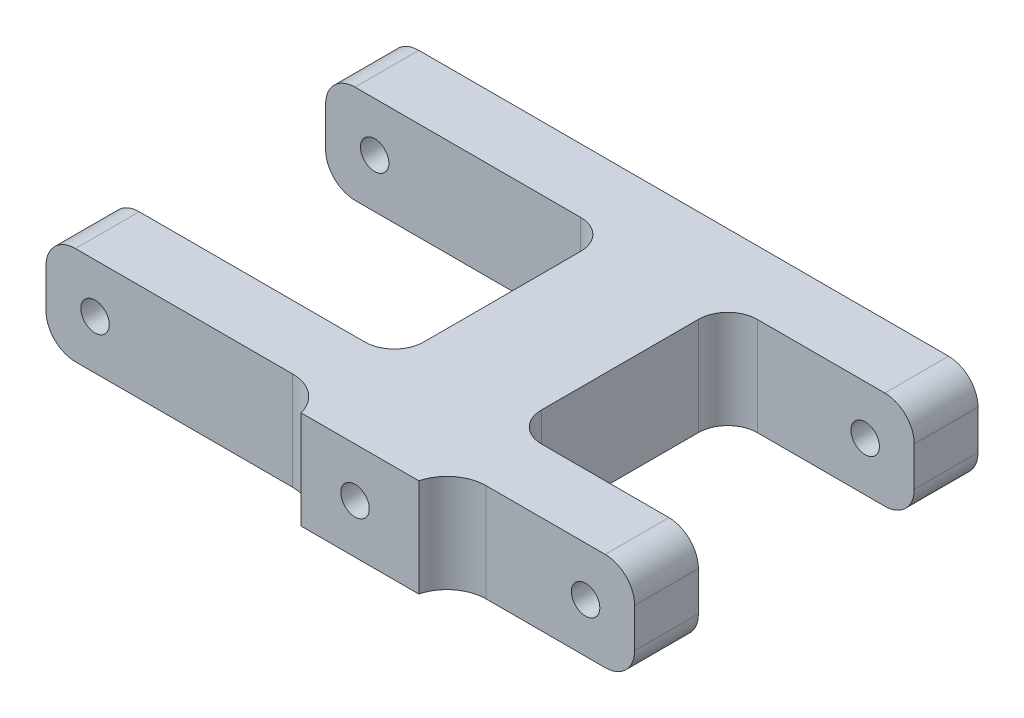
ISO-10303-21;
HEADER;
FILE_DESCRIPTION(('STEP AP214'),'2;1');
FILE_NAME('part.step','',(''),(''),'','','');
FILE_SCHEMA(('AUTOMOTIVE_DESIGN { 1 0 10303 214 1 1 1 1 }'));
ENDSEC;
DATA;
#1=APPLICATION_CONTEXT('core data for automotive mechanical design processes');
#2=APPLICATION_PROTOCOL_DEFINITION('international standard','automotive_design',2000,#1);
#3=PRODUCT_CONTEXT('',#1,'mechanical');
#4=PRODUCT('Part','Part','',(#3));
#5=PRODUCT_RELATED_PRODUCT_CATEGORY('part','',(#4));
#6=PRODUCT_DEFINITION_FORMATION('','',#4);
#7=PRODUCT_DEFINITION_CONTEXT('part definition',#1,'design');
#8=PRODUCT_DEFINITION('design','',#6,#7);
#9=PRODUCT_DEFINITION_SHAPE('','',#8);
#10=(LENGTH_UNIT() NAMED_UNIT(*) SI_UNIT(.MILLI.,.METRE.));
#11=(NAMED_UNIT(*) PLANE_ANGLE_UNIT() SI_UNIT($,.RADIAN.));
#12=(NAMED_UNIT(*) SI_UNIT($,.STERADIAN.) SOLID_ANGLE_UNIT());
#13=UNCERTAINTY_MEASURE_WITH_UNIT(LENGTH_MEASURE(1.E-05),#10,'distance_accuracy_value','');
#14=(GEOMETRIC_REPRESENTATION_CONTEXT(3) GLOBAL_UNCERTAINTY_ASSIGNED_CONTEXT((#13)) GLOBAL_UNIT_ASSIGNED_CONTEXT((#10,
#11,#12)) REPRESENTATION_CONTEXT('',''));
#15=CARTESIAN_POINT('',(0.,0.,0.));
#16=DIRECTION('',(0.,0.,1.));
#17=DIRECTION('',(1.,0.,0.));
#18=AXIS2_PLACEMENT_3D('',#15,#16,#17);
#19=CARTESIAN_POINT('',(0.,10.,35.));
#20=DIRECTION('',(0.,0.,-1.));
#21=DIRECTION('',(-1.,0.,0.));
#22=AXIS2_PLACEMENT_3D('',#19,#20,#21);
#23=PLANE('',#22);
#24=CARTESIAN_POINT('',(5.,5.,35.));
#25=DIRECTION('',(0.,0.,1.));
#26=DIRECTION('',(1.,0.,0.));
#27=AXIS2_PLACEMENT_3D('',#24,#25,#26);
#28=CIRCLE('',#27,1.45);
#29=CARTESIAN_POINT('',(6.45,5.,35.));
#30=VERTEX_POINT('',#29);
#31=EDGE_CURVE('E254',#30,#30,#28,.T.);
#32=ORIENTED_EDGE('',*,*,#31,.F.);
#33=EDGE_LOOP('',(#32));
#34=FACE_BOUND('',#33,.T.);
#35=DIRECTION('',(1.,0.,0.));
#36=VECTOR('',#35,1.);
#37=CARTESIAN_POINT('',(0.,0.,35.));
#38=LINE('',#37,#36);
#39=CARTESIAN_POINT('',(3.,0.,35.));
#40=VERTEX_POINT('',#39);
#41=CARTESIAN_POINT('',(25.1270166537926,0.,35.));
#42=VERTEX_POINT('',#41);
#43=EDGE_CURVE('E312',#40,#42,#38,.T.);
#44=ORIENTED_EDGE('',*,*,#43,.T.);
#45=DIRECTION('',(0.,-1.,0.));
#46=VECTOR('',#45,1.);
#47=CARTESIAN_POINT('',(25.1270166537926,10.,35.));
#48=LINE('',#47,#46);
#49=CARTESIAN_POINT('',(25.1270166537926,10.,35.));
#50=VERTEX_POINT('',#49);
#51=EDGE_CURVE('E54',#42,#50,#48,.F.);
#52=ORIENTED_EDGE('',*,*,#51,.T.);
#53=DIRECTION('',(1.,0.,0.));
#54=VECTOR('',#53,1.);
#55=CARTESIAN_POINT('',(0.,10.,35.));
#56=LINE('',#55,#54);
#57=CARTESIAN_POINT('',(3.,10.,35.));
#58=VERTEX_POINT('',#57);
#59=EDGE_CURVE('E305',#58,#50,#56,.T.);
#60=ORIENTED_EDGE('',*,*,#59,.F.);
#61=CARTESIAN_POINT('',(3.,7.,35.));
#62=DIRECTION('',(0.,0.,-1.));
#63=DIRECTION('',(-1.,0.,0.));
#64=AXIS2_PLACEMENT_3D('',#61,#62,#63);
#65=CIRCLE('',#64,3.);
#66=CARTESIAN_POINT('',(0.,7.,35.));
#67=VERTEX_POINT('',#66);
#68=EDGE_CURVE('E342',#58,#67,#65,.F.);
#69=ORIENTED_EDGE('',*,*,#68,.T.);
#70=DIRECTION('',(0.,-1.,0.));
#71=VECTOR('',#70,1.);
#72=CARTESIAN_POINT('',(0.,10.,35.));
#73=LINE('',#72,#71);
#74=CARTESIAN_POINT('',(0.,3.,35.));
#75=VERTEX_POINT('',#74);
#76=EDGE_CURVE('E325',#67,#75,#73,.T.);
#77=ORIENTED_EDGE('',*,*,#76,.T.);
#78=CARTESIAN_POINT('',(3.,3.,35.));
#79=DIRECTION('',(0.,0.,-1.));
#80=DIRECTION('',(-1.,0.,0.));
#81=AXIS2_PLACEMENT_3D('',#78,#79,#80);
#82=CIRCLE('',#81,3.);
#83=EDGE_CURVE('E344',#75,#40,#82,.F.);
#84=ORIENTED_EDGE('',*,*,#83,.T.);
#85=EDGE_LOOP('',(#44,#52,#60,#69,#77,#84));
#86=FACE_BOUND('',#85,.T.);
#87=ADVANCED_FACE('F33',(#34,#86),#23,.F.);
#88=CARTESIAN_POINT('',(55.,5.,35.));
#89=DIRECTION('',(0.,0.,1.));
#90=DIRECTION('',(1.,0.,0.));
#91=AXIS2_PLACEMENT_3D('',#88,#89,#90);
#92=CIRCLE('',#91,1.45);
#93=CARTESIAN_POINT('',(56.45,5.,35.));
#94=VERTEX_POINT('',#93);
#95=EDGE_CURVE('E244',#94,#94,#92,.T.);
#96=ORIENTED_EDGE('',*,*,#95,.F.);
#97=EDGE_LOOP('',(#96));
#98=FACE_BOUND('',#97,.T.);
#99=CARTESIAN_POINT('',(44.8729833462074,10.,35.));
#100=VERTEX_POINT('',#99);
#101=CARTESIAN_POINT('',(57.,10.,35.));
#102=VERTEX_POINT('',#101);
#103=EDGE_CURVE('E308',#100,#102,#56,.T.);
#104=ORIENTED_EDGE('',*,*,#103,.F.);
#105=DIRECTION('',(0.,1.,0.));
#106=VECTOR('',#105,1.);
#107=CARTESIAN_POINT('',(44.8729833462074,10.,35.));
#108=LINE('',#107,#106);
#109=CARTESIAN_POINT('',(44.8729833462074,0.,35.));
#110=VERTEX_POINT('',#109);
#111=EDGE_CURVE('E448',#100,#110,#108,.F.);
#112=ORIENTED_EDGE('',*,*,#111,.T.);
#113=CARTESIAN_POINT('',(57.,0.,35.));
#114=VERTEX_POINT('',#113);
#115=EDGE_CURVE('E299',#110,#114,#38,.T.);
#116=ORIENTED_EDGE('',*,*,#115,.T.);
#117=CARTESIAN_POINT('',(57.,3.,35.));
#118=DIRECTION('',(0.,0.,-1.));
#119=DIRECTION('',(-1.,0.,0.));
#120=AXIS2_PLACEMENT_3D('',#117,#118,#119);
#121=CIRCLE('',#120,3.);
#122=CARTESIAN_POINT('',(60.,3.,35.));
#123=VERTEX_POINT('',#122);
#124=EDGE_CURVE('E340',#114,#123,#121,.F.);
#125=ORIENTED_EDGE('',*,*,#124,.T.);
#126=DIRECTION('',(0.,-1.,0.));
#127=VECTOR('',#126,1.);
#128=CARTESIAN_POINT('',(60.,10.,35.));
#129=LINE('',#128,#127);
#130=CARTESIAN_POINT('',(60.,7.,35.));
#131=VERTEX_POINT('',#130);
#132=EDGE_CURVE('E322',#131,#123,#129,.T.);
#133=ORIENTED_EDGE('',*,*,#132,.F.);
#134=CARTESIAN_POINT('',(57.,7.,35.));
#135=DIRECTION('',(0.,0.,-1.));
#136=DIRECTION('',(-1.,0.,0.));
#137=AXIS2_PLACEMENT_3D('',#134,#135,#136);
#138=CIRCLE('',#137,3.);
#139=EDGE_CURVE('E337',#131,#102,#138,.F.);
#140=ORIENTED_EDGE('',*,*,#139,.T.);
#141=EDGE_LOOP('',(#104,#112,#116,#125,#133,#140));
#142=FACE_BOUND('',#141,.T.);
#143=ADVANCED_FACE('F460',(#98,#142),#23,.F.);
#144=CARTESIAN_POINT('',(0.,10.,0.));
#145=DIRECTION('',(1.,0.,0.));
#146=DIRECTION('',(0.,0.,-1.));
#147=AXIS2_PLACEMENT_3D('',#144,#145,#146);
#148=PLANE('',#147);
#149=DIRECTION('',(0.,-1.,0.));
#150=VECTOR('',#149,1.);
#151=CARTESIAN_POINT('',(0.,10.,0.));
#152=LINE('',#151,#150);
#153=CARTESIAN_POINT('',(0.,7.,0.));
#154=VERTEX_POINT('',#153);
#155=CARTESIAN_POINT('',(0.,3.,0.));
#156=VERTEX_POINT('',#155);
#157=EDGE_CURVE('E311',#154,#156,#152,.T.);
#158=ORIENTED_EDGE('',*,*,#157,.T.);
#159=DIRECTION('',(0.,0.,1.));
#160=VECTOR('',#159,1.);
#161=CARTESIAN_POINT('',(0.,3.,0.));
#162=LINE('',#161,#160);
#163=CARTESIAN_POINT('',(0.,3.,6.5));
#164=VERTEX_POINT('',#163);
#165=EDGE_CURVE('E376',#156,#164,#162,.T.);
#166=ORIENTED_EDGE('',*,*,#165,.T.);
#167=DIRECTION('',(0.,-1.,0.));
#168=VECTOR('',#167,1.);
#169=CARTESIAN_POINT('',(0.,10.,6.5));
#170=LINE('',#169,#168);
#171=CARTESIAN_POINT('',(0.,7.,6.5));
#172=VERTEX_POINT('',#171);
#173=EDGE_CURVE('E264',#172,#164,#170,.T.);
#174=ORIENTED_EDGE('',*,*,#173,.F.);
#175=DIRECTION('',(0.,0.,1.));
#176=VECTOR('',#175,1.);
#177=CARTESIAN_POINT('',(0.,7.,0.));
#178=LINE('',#177,#176);
#179=EDGE_CURVE('E374',#172,#154,#178,.F.);
#180=ORIENTED_EDGE('',*,*,#179,.T.);
#181=EDGE_LOOP('',(#158,#166,#174,#180));
#182=FACE_BOUND('',#181,.T.);
#183=ADVANCED_FACE('F481',(#182),#148,.F.);
#184=CARTESIAN_POINT('',(60.,10.,0.));
#185=DIRECTION('',(-1.,0.,0.));
#186=DIRECTION('',(0.,0.,1.));
#187=AXIS2_PLACEMENT_3D('',#184,#185,#186);
#188=PLANE('',#187);
#189=ORIENTED_EDGE('',*,*,#132,.T.);
#190=DIRECTION('',(0.,0.,-1.));
#191=VECTOR('',#190,1.);
#192=CARTESIAN_POINT('',(60.,3.,0.));
#193=LINE('',#192,#191);
#194=CARTESIAN_POINT('',(60.,3.,28.5));
#195=VERTEX_POINT('',#194);
#196=EDGE_CURVE('E404',#123,#195,#193,.T.);
#197=ORIENTED_EDGE('',*,*,#196,.T.);
#198=DIRECTION('',(0.,-1.,0.));
#199=VECTOR('',#198,1.);
#200=CARTESIAN_POINT('',(60.,10.,28.5));
#201=LINE('',#200,#199);
#202=CARTESIAN_POINT('',(60.,7.,28.5));
#203=VERTEX_POINT('',#202);
#204=EDGE_CURVE('E279',#203,#195,#201,.T.);
#205=ORIENTED_EDGE('',*,*,#204,.F.);
#206=DIRECTION('',(0.,0.,-1.));
#207=VECTOR('',#206,1.);
#208=CARTESIAN_POINT('',(60.,7.,35.));
#209=LINE('',#208,#207);
#210=EDGE_CURVE('E402',#203,#131,#209,.F.);
#211=ORIENTED_EDGE('',*,*,#210,.T.);
#212=EDGE_LOOP('',(#189,#197,#205,#211));
#213=FACE_BOUND('',#212,.T.);
#214=ADVANCED_FACE('F491',(#213),#188,.F.);
#215=DIRECTION('',(0.,1.,0.));
#216=VECTOR('',#215,1.);
#217=CARTESIAN_POINT('',(0.,10.,28.5));
#218=LINE('',#217,#216);
#219=CARTESIAN_POINT('',(0.,3.,28.5));
#220=VERTEX_POINT('',#219);
#221=CARTESIAN_POINT('',(0.,7.,28.5));
#222=VERTEX_POINT('',#221);
#223=EDGE_CURVE('E269',#220,#222,#218,.T.);
#224=ORIENTED_EDGE('',*,*,#223,.F.);
#225=DIRECTION('',(0.,0.,1.));
#226=VECTOR('',#225,1.);
#227=CARTESIAN_POINT('',(0.,3.,0.));
#228=LINE('',#227,#226);
#229=EDGE_CURVE('E334',#220,#75,#228,.T.);
#230=ORIENTED_EDGE('',*,*,#229,.T.);
#231=ORIENTED_EDGE('',*,*,#76,.F.);
#232=DIRECTION('',(0.,0.,1.));
#233=VECTOR('',#232,1.);
#234=CARTESIAN_POINT('',(0.,7.,28.5));
#235=LINE('',#234,#233);
#236=EDGE_CURVE('E328',#67,#222,#235,.F.);
#237=ORIENTED_EDGE('',*,*,#236,.T.);
#238=EDGE_LOOP('',(#224,#230,#231,#237));
#239=FACE_BOUND('',#238,.T.);
#240=ADVANCED_FACE('F488',(#239),#148,.F.);
#241=DIRECTION('',(0.,-1.,0.));
#242=VECTOR('',#241,1.);
#243=CARTESIAN_POINT('',(60.,10.,0.));
#244=LINE('',#243,#242);
#245=CARTESIAN_POINT('',(60.,7.,0.));
#246=VERTEX_POINT('',#245);
#247=CARTESIAN_POINT('',(60.,3.,0.));
#248=VERTEX_POINT('',#247);
#249=EDGE_CURVE('E319',#246,#248,#244,.T.);
#250=ORIENTED_EDGE('',*,*,#249,.F.);
#251=DIRECTION('',(0.,0.,-1.));
#252=VECTOR('',#251,1.);
#253=CARTESIAN_POINT('',(60.,7.,6.5));
#254=LINE('',#253,#252);
#255=CARTESIAN_POINT('',(60.,7.,6.5));
#256=VERTEX_POINT('',#255);
#257=EDGE_CURVE('E395',#246,#256,#254,.F.);
#258=ORIENTED_EDGE('',*,*,#257,.T.);
#259=DIRECTION('',(0.,1.,0.));
#260=VECTOR('',#259,1.);
#261=CARTESIAN_POINT('',(60.,10.,6.5));
#262=LINE('',#261,#260);
#263=CARTESIAN_POINT('',(60.,3.,6.5));
#264=VERTEX_POINT('',#263);
#265=EDGE_CURVE('E289',#264,#256,#262,.T.);
#266=ORIENTED_EDGE('',*,*,#265,.F.);
#267=DIRECTION('',(0.,0.,-1.));
#268=VECTOR('',#267,1.);
#269=CARTESIAN_POINT('',(60.,3.,0.));
#270=LINE('',#269,#268);
#271=EDGE_CURVE('E392',#264,#248,#270,.T.);
#272=ORIENTED_EDGE('',*,*,#271,.T.);
#273=EDGE_LOOP('',(#250,#258,#266,#272));
#274=FACE_BOUND('',#273,.T.);
#275=ADVANCED_FACE('F486',(#274),#188,.F.);
#276=CARTESIAN_POINT('',(0.,10.,0.));
#277=DIRECTION('',(0.,0.,1.));
#278=DIRECTION('',(1.,0.,0.));
#279=AXIS2_PLACEMENT_3D('',#276,#277,#278);
#280=PLANE('',#279);
#281=CARTESIAN_POINT('',(55.,5.,0.));
#282=DIRECTION('',(0.,0.,1.));
#283=DIRECTION('',(1.,0.,0.));
#284=AXIS2_PLACEMENT_3D('',#281,#282,#283);
#285=CIRCLE('',#284,1.45);
#286=CARTESIAN_POINT('',(56.45,5.,0.));
#287=VERTEX_POINT('',#286);
#288=EDGE_CURVE('E245',#287,#287,#285,.T.);
#289=ORIENTED_EDGE('',*,*,#288,.T.);
#290=EDGE_LOOP('',(#289));
#291=FACE_BOUND('',#290,.T.);
#292=CARTESIAN_POINT('',(5.,5.,0.));
#293=DIRECTION('',(0.,0.,1.));
#294=DIRECTION('',(1.,0.,0.));
#295=AXIS2_PLACEMENT_3D('',#292,#293,#294);
#296=CIRCLE('',#295,1.45);
#297=CARTESIAN_POINT('',(6.45,5.,0.));
#298=VERTEX_POINT('',#297);
#299=EDGE_CURVE('E255',#298,#298,#296,.T.);
#300=ORIENTED_EDGE('',*,*,#299,.T.);
#301=EDGE_LOOP('',(#300));
#302=FACE_BOUND('',#301,.T.);
#303=DIRECTION('',(-1.,0.,0.));
#304=VECTOR('',#303,1.);
#305=CARTESIAN_POINT('',(0.,0.,0.));
#306=LINE('',#305,#304);
#307=CARTESIAN_POINT('',(57.,0.,0.));
#308=VERTEX_POINT('',#307);
#309=CARTESIAN_POINT('',(3.,0.,0.));
#310=VERTEX_POINT('',#309);
#311=EDGE_CURVE('E314',#308,#310,#306,.T.);
#312=ORIENTED_EDGE('',*,*,#311,.T.);
#313=CARTESIAN_POINT('',(3.,3.,0.));
#314=DIRECTION('',(0.,0.,1.));
#315=DIRECTION('',(1.,0.,0.));
#316=AXIS2_PLACEMENT_3D('',#313,#314,#315);
#317=CIRCLE('',#316,3.);
#318=EDGE_CURVE('E390',#310,#156,#317,.F.);
#319=ORIENTED_EDGE('',*,*,#318,.T.);
#320=ORIENTED_EDGE('',*,*,#157,.F.);
#321=CARTESIAN_POINT('',(3.,7.,0.));
#322=DIRECTION('',(0.,0.,1.));
#323=DIRECTION('',(1.,0.,0.));
#324=AXIS2_PLACEMENT_3D('',#321,#322,#323);
#325=CIRCLE('',#324,3.);
#326=CARTESIAN_POINT('',(3.,10.,0.));
#327=VERTEX_POINT('',#326);
#328=EDGE_CURVE('E388',#154,#327,#325,.F.);
#329=ORIENTED_EDGE('',*,*,#328,.T.);
#330=DIRECTION('',(-1.,0.,0.));
#331=VECTOR('',#330,1.);
#332=CARTESIAN_POINT('',(0.,10.,0.));
#333=LINE('',#332,#331);
#334=CARTESIAN_POINT('',(57.,10.,0.));
#335=VERTEX_POINT('',#334);
#336=EDGE_CURVE('E307',#335,#327,#333,.T.);
#337=ORIENTED_EDGE('',*,*,#336,.F.);
#338=CARTESIAN_POINT('',(57.,7.,0.));
#339=DIRECTION('',(0.,0.,1.));
#340=DIRECTION('',(1.,0.,0.));
#341=AXIS2_PLACEMENT_3D('',#338,#339,#340);
#342=CIRCLE('',#341,3.);
#343=EDGE_CURVE('E386',#335,#246,#342,.F.);
#344=ORIENTED_EDGE('',*,*,#343,.T.);
#345=ORIENTED_EDGE('',*,*,#249,.T.);
#346=CARTESIAN_POINT('',(57.,3.,0.));
#347=DIRECTION('',(0.,0.,1.));
#348=DIRECTION('',(1.,0.,0.));
#349=AXIS2_PLACEMENT_3D('',#346,#347,#348);
#350=CIRCLE('',#349,3.);
#351=EDGE_CURVE('E384',#248,#308,#350,.F.);
#352=ORIENTED_EDGE('',*,*,#351,.T.);
#353=EDGE_LOOP('',(#312,#319,#320,#329,#337,#344,#345,#352));
#354=FACE_BOUND('',#353,.T.);
#355=ADVANCED_FACE('F577',(#291,#302,#354),#280,.F.);
#356=CARTESIAN_POINT('',(0.,10.,0.));
#357=DIRECTION('',(0.,1.,0.));
#358=DIRECTION('',(0.,0.,1.));
#359=AXIS2_PLACEMENT_3D('',#356,#357,#358);
#360=PLANE('',#359);
#361=DIRECTION('',(0.,0.,-1.));
#362=VECTOR('',#361,1.);
#363=CARTESIAN_POINT('',(29.,10.,6.5));
#364=LINE('',#363,#362);
#365=CARTESIAN_POINT('',(29.,10.,25.5));
#366=VERTEX_POINT('',#365);
#367=CARTESIAN_POINT('',(29.,10.,9.5));
#368=VERTEX_POINT('',#367);
#369=EDGE_CURVE('E268',#366,#368,#364,.T.);
#370=ORIENTED_EDGE('',*,*,#369,.F.);
#371=CARTESIAN_POINT('',(26.,10.,25.5));
#372=DIRECTION('',(0.,1.,0.));
#373=DIRECTION('',(0.,0.,1.));
#374=AXIS2_PLACEMENT_3D('',#371,#372,#373);
#375=CIRCLE('',#374,3.);
#376=CARTESIAN_POINT('',(26.,10.,28.5));
#377=VERTEX_POINT('',#376);
#378=EDGE_CURVE('E440',#366,#377,#375,.F.);
#379=ORIENTED_EDGE('',*,*,#378,.T.);
#380=DIRECTION('',(-1.,0.,0.));
#381=VECTOR('',#380,1.);
#382=CARTESIAN_POINT('',(29.,10.,28.5));
#383=LINE('',#382,#381);
#384=CARTESIAN_POINT('',(3.00000000000001,10.,28.5));
#385=VERTEX_POINT('',#384);
#386=EDGE_CURVE('E280',#377,#385,#383,.T.);
#387=ORIENTED_EDGE('',*,*,#386,.T.);
#388=DIRECTION('',(0.,0.,1.));
#389=VECTOR('',#388,1.);
#390=CARTESIAN_POINT('',(3.,10.,35.));
#391=LINE('',#390,#389);
#392=EDGE_CURVE('E371',#385,#58,#391,.T.);
#393=ORIENTED_EDGE('',*,*,#392,.T.);
#394=ORIENTED_EDGE('',*,*,#59,.T.);
#395=CARTESIAN_POINT('',(25.1270166537926,10.,39.));
#396=DIRECTION('',(0.,1.,0.));
#397=DIRECTION('',(0.,0.,1.));
#398=AXIS2_PLACEMENT_3D('',#395,#396,#397);
#399=CIRCLE('',#398,4.);
#400=CARTESIAN_POINT('',(29.,10.,38.));
#401=VERTEX_POINT('',#400);
#402=EDGE_CURVE('E11',#50,#401,#399,.F.);
#403=ORIENTED_EDGE('',*,*,#402,.T.);
#404=DIRECTION('',(-1.,0.,0.));
#405=VECTOR('',#404,1.);
#406=CARTESIAN_POINT('',(29.,10.,38.));
#407=LINE('',#406,#405);
#408=CARTESIAN_POINT('',(41.,10.,38.));
#409=VERTEX_POINT('',#408);
#410=EDGE_CURVE('E234',#409,#401,#407,.T.);
#411=ORIENTED_EDGE('',*,*,#410,.F.);
#412=CARTESIAN_POINT('',(44.8729833462074,10.,39.));
#413=DIRECTION('',(0.,1.,0.));
#414=DIRECTION('',(0.,0.,1.));
#415=AXIS2_PLACEMENT_3D('',#412,#413,#414);
#416=CIRCLE('',#415,4.);
#417=EDGE_CURVE('E451',#409,#100,#416,.F.);
#418=ORIENTED_EDGE('',*,*,#417,.T.);
#419=ORIENTED_EDGE('',*,*,#103,.T.);
#420=DIRECTION('',(0.,0.,-1.));
#421=VECTOR('',#420,1.);
#422=CARTESIAN_POINT('',(57.,10.,28.5));
#423=LINE('',#422,#421);
#424=CARTESIAN_POINT('',(57.,10.,28.5));
#425=VERTEX_POINT('',#424);
#426=EDGE_CURVE('E362',#102,#425,#423,.T.);
#427=ORIENTED_EDGE('',*,*,#426,.T.);
#428=DIRECTION('',(1.,0.,0.));
#429=VECTOR('',#428,1.);
#430=CARTESIAN_POINT('',(41.,10.,28.5));
#431=LINE('',#430,#429);
#432=CARTESIAN_POINT('',(44.,10.,28.5));
#433=VERTEX_POINT('',#432);
#434=EDGE_CURVE('E297',#433,#425,#431,.T.);
#435=ORIENTED_EDGE('',*,*,#434,.F.);
#436=CARTESIAN_POINT('',(44.,10.,25.5));
#437=DIRECTION('',(0.,1.,0.));
#438=DIRECTION('',(0.,0.,1.));
#439=AXIS2_PLACEMENT_3D('',#436,#437,#438);
#440=CIRCLE('',#439,3.);
#441=CARTESIAN_POINT('',(41.,10.,25.5));
#442=VERTEX_POINT('',#441);
#443=EDGE_CURVE('E434',#433,#442,#440,.F.);
#444=ORIENTED_EDGE('',*,*,#443,.T.);
#445=DIRECTION('',(0.,0.,1.));
#446=VECTOR('',#445,1.);
#447=CARTESIAN_POINT('',(41.,10.,28.5));
#448=LINE('',#447,#446);
#449=CARTESIAN_POINT('',(41.,10.,9.5));
#450=VERTEX_POINT('',#449);
#451=EDGE_CURVE('E288',#450,#442,#448,.T.);
#452=ORIENTED_EDGE('',*,*,#451,.F.);
#453=CARTESIAN_POINT('',(44.,10.,9.5));
#454=DIRECTION('',(0.,1.,0.));
#455=DIRECTION('',(0.,0.,1.));
#456=AXIS2_PLACEMENT_3D('',#453,#454,#455);
#457=CIRCLE('',#456,3.);
#458=CARTESIAN_POINT('',(44.,10.,6.5));
#459=VERTEX_POINT('',#458);
#460=EDGE_CURVE('E436',#450,#459,#457,.F.);
#461=ORIENTED_EDGE('',*,*,#460,.T.);
#462=DIRECTION('',(1.,0.,0.));
#463=VECTOR('',#462,1.);
#464=CARTESIAN_POINT('',(41.,10.,6.5));
#465=LINE('',#464,#463);
#466=CARTESIAN_POINT('',(57.,10.,6.5));
#467=VERTEX_POINT('',#466);
#468=EDGE_CURVE('E300',#459,#467,#465,.T.);
#469=ORIENTED_EDGE('',*,*,#468,.T.);
#470=DIRECTION('',(0.,0.,-1.));
#471=VECTOR('',#470,1.);
#472=CARTESIAN_POINT('',(57.,10.,0.));
#473=LINE('',#472,#471);
#474=EDGE_CURVE('E365',#467,#335,#473,.T.);
#475=ORIENTED_EDGE('',*,*,#474,.T.);
#476=ORIENTED_EDGE('',*,*,#336,.T.);
#477=DIRECTION('',(0.,0.,1.));
#478=VECTOR('',#477,1.);
#479=CARTESIAN_POINT('',(3.,10.,6.5));
#480=LINE('',#479,#478);
#481=CARTESIAN_POINT('',(3.00000000000001,10.,6.5));
#482=VERTEX_POINT('',#481);
#483=EDGE_CURVE('E368',#327,#482,#480,.T.);
#484=ORIENTED_EDGE('',*,*,#483,.T.);
#485=DIRECTION('',(-1.,0.,0.));
#486=VECTOR('',#485,1.);
#487=CARTESIAN_POINT('',(29.,10.,6.5));
#488=LINE('',#487,#486);
#489=CARTESIAN_POINT('',(26.,10.,6.5));
#490=VERTEX_POINT('',#489);
#491=EDGE_CURVE('E277',#490,#482,#488,.T.);
#492=ORIENTED_EDGE('',*,*,#491,.F.);
#493=CARTESIAN_POINT('',(26.,10.,9.5));
#494=DIRECTION('',(0.,1.,0.));
#495=DIRECTION('',(0.,0.,1.));
#496=AXIS2_PLACEMENT_3D('',#493,#494,#495);
#497=CIRCLE('',#496,3.);
#498=EDGE_CURVE('E446',#490,#368,#497,.F.);
#499=ORIENTED_EDGE('',*,*,#498,.T.);
#500=EDGE_LOOP('',(#370,#379,#387,#393,#394,#403,#411,#418,#419,#427,#435,#444,#452,#461,#469,
#475,#476,#484,#492,#499));
#501=FACE_BOUND('',#500,.T.);
#502=ADVANCED_FACE('F456',(#501),#360,.T.);
#503=CARTESIAN_POINT('',(0.,0.,0.));
#504=DIRECTION('',(0.,1.,0.));
#505=DIRECTION('',(0.,0.,1.));
#506=AXIS2_PLACEMENT_3D('',#503,#504,#505);
#507=PLANE('',#506);
#508=ORIENTED_EDGE('',*,*,#43,.F.);
#509=DIRECTION('',(0.,0.,1.));
#510=VECTOR('',#509,1.);
#511=CARTESIAN_POINT('',(3.,0.,0.));
#512=LINE('',#511,#510);
#513=CARTESIAN_POINT('',(3.00000000000001,0.,28.5));
#514=VERTEX_POINT('',#513);
#515=EDGE_CURVE('E354',#40,#514,#512,.F.);
#516=ORIENTED_EDGE('',*,*,#515,.T.);
#517=DIRECTION('',(-1.,0.,0.));
#518=VECTOR('',#517,1.);
#519=CARTESIAN_POINT('',(29.,0.,28.5));
#520=LINE('',#519,#518);
#521=CARTESIAN_POINT('',(26.,0.,28.5));
#522=VERTEX_POINT('',#521);
#523=EDGE_CURVE('E282',#522,#514,#520,.T.);
#524=ORIENTED_EDGE('',*,*,#523,.F.);
#525=CARTESIAN_POINT('',(26.,0.,25.5));
#526=DIRECTION('',(0.,1.,0.));
#527=DIRECTION('',(0.,0.,1.));
#528=AXIS2_PLACEMENT_3D('',#525,#526,#527);
#529=CIRCLE('',#528,3.);
#530=CARTESIAN_POINT('',(29.,0.,25.5));
#531=VERTEX_POINT('',#530);
#532=EDGE_CURVE('E442',#522,#531,#529,.T.);
#533=ORIENTED_EDGE('',*,*,#532,.T.);
#534=DIRECTION('',(0.,0.,1.));
#535=VECTOR('',#534,1.);
#536=CARTESIAN_POINT('',(29.,0.,6.5));
#537=LINE('',#536,#535);
#538=CARTESIAN_POINT('',(29.,0.,9.5));
#539=VERTEX_POINT('',#538);
#540=EDGE_CURVE('E265',#539,#531,#537,.T.);
#541=ORIENTED_EDGE('',*,*,#540,.F.);
#542=CARTESIAN_POINT('',(26.,0.,9.5));
#543=DIRECTION('',(0.,1.,0.));
#544=DIRECTION('',(0.,0.,1.));
#545=AXIS2_PLACEMENT_3D('',#542,#543,#544);
#546=CIRCLE('',#545,3.);
#547=CARTESIAN_POINT('',(26.,0.,6.5));
#548=VERTEX_POINT('',#547);
#549=EDGE_CURVE('E444',#539,#548,#546,.T.);
#550=ORIENTED_EDGE('',*,*,#549,.T.);
#551=DIRECTION('',(-1.,0.,0.));
#552=VECTOR('',#551,1.);
#553=CARTESIAN_POINT('',(29.,0.,6.5));
#554=LINE('',#553,#552);
#555=CARTESIAN_POINT('',(3.00000000000001,0.,6.5));
#556=VERTEX_POINT('',#555);
#557=EDGE_CURVE('E272',#548,#556,#554,.T.);
#558=ORIENTED_EDGE('',*,*,#557,.T.);
#559=DIRECTION('',(0.,0.,1.));
#560=VECTOR('',#559,1.);
#561=CARTESIAN_POINT('',(3.,0.,0.));
#562=LINE('',#561,#560);
#563=EDGE_CURVE('E352',#556,#310,#562,.F.);
#564=ORIENTED_EDGE('',*,*,#563,.T.);
#565=ORIENTED_EDGE('',*,*,#311,.F.);
#566=DIRECTION('',(0.,0.,-1.));
#567=VECTOR('',#566,1.);
#568=CARTESIAN_POINT('',(57.,0.,0.));
#569=LINE('',#568,#567);
#570=CARTESIAN_POINT('',(57.,0.,6.5));
#571=VERTEX_POINT('',#570);
#572=EDGE_CURVE('E349',#308,#571,#569,.F.);
#573=ORIENTED_EDGE('',*,*,#572,.T.);
#574=DIRECTION('',(1.,0.,0.));
#575=VECTOR('',#574,1.);
#576=CARTESIAN_POINT('',(41.,0.,6.5));
#577=LINE('',#576,#575);
#578=CARTESIAN_POINT('',(44.,0.,6.5));
#579=VERTEX_POINT('',#578);
#580=EDGE_CURVE('E302',#579,#571,#577,.T.);
#581=ORIENTED_EDGE('',*,*,#580,.F.);
#582=CARTESIAN_POINT('',(44.,0.,9.5));
#583=DIRECTION('',(0.,1.,0.));
#584=DIRECTION('',(0.,0.,1.));
#585=AXIS2_PLACEMENT_3D('',#582,#583,#584);
#586=CIRCLE('',#585,3.);
#587=CARTESIAN_POINT('',(41.,0.,9.5));
#588=VERTEX_POINT('',#587);
#589=EDGE_CURVE('E438',#579,#588,#586,.T.);
#590=ORIENTED_EDGE('',*,*,#589,.T.);
#591=DIRECTION('',(0.,0.,-1.));
#592=VECTOR('',#591,1.);
#593=CARTESIAN_POINT('',(41.,0.,28.5));
#594=LINE('',#593,#592);
#595=CARTESIAN_POINT('',(41.,0.,25.5));
#596=VERTEX_POINT('',#595);
#597=EDGE_CURVE('E285',#596,#588,#594,.T.);
#598=ORIENTED_EDGE('',*,*,#597,.F.);
#599=CARTESIAN_POINT('',(44.,0.,25.5));
#600=DIRECTION('',(0.,1.,0.));
#601=DIRECTION('',(0.,0.,1.));
#602=AXIS2_PLACEMENT_3D('',#599,#600,#601);
#603=CIRCLE('',#602,3.);
#604=CARTESIAN_POINT('',(44.,0.,28.5));
#605=VERTEX_POINT('',#604);
#606=EDGE_CURVE('E432',#596,#605,#603,.T.);
#607=ORIENTED_EDGE('',*,*,#606,.T.);
#608=DIRECTION('',(1.,0.,0.));
#609=VECTOR('',#608,1.);
#610=CARTESIAN_POINT('',(41.,0.,28.5));
#611=LINE('',#610,#609);
#612=CARTESIAN_POINT('',(57.,0.,28.5));
#613=VERTEX_POINT('',#612);
#614=EDGE_CURVE('E292',#605,#613,#611,.T.);
#615=ORIENTED_EDGE('',*,*,#614,.T.);
#616=DIRECTION('',(0.,0.,-1.));
#617=VECTOR('',#616,1.);
#618=CARTESIAN_POINT('',(57.,0.,0.));
#619=LINE('',#618,#617);
#620=EDGE_CURVE('E346',#613,#114,#619,.F.);
#621=ORIENTED_EDGE('',*,*,#620,.T.);
#622=ORIENTED_EDGE('',*,*,#115,.F.);
#623=CARTESIAN_POINT('',(44.8729833462074,0.,39.));
#624=DIRECTION('',(0.,1.,0.));
#625=DIRECTION('',(0.,0.,1.));
#626=AXIS2_PLACEMENT_3D('',#623,#624,#625);
#627=CIRCLE('',#626,4.);
#628=CARTESIAN_POINT('',(41.,0.,38.));
#629=VERTEX_POINT('',#628);
#630=EDGE_CURVE('E220',#110,#629,#627,.T.);
#631=ORIENTED_EDGE('',*,*,#630,.T.);
#632=DIRECTION('',(1.,0.,0.));
#633=VECTOR('',#632,1.);
#634=CARTESIAN_POINT('',(29.,0.,38.));
#635=LINE('',#634,#633);
#636=CARTESIAN_POINT('',(29.,0.,38.));
#637=VERTEX_POINT('',#636);
#638=EDGE_CURVE('E222',#637,#629,#635,.T.);
#639=ORIENTED_EDGE('',*,*,#638,.F.);
#640=CARTESIAN_POINT('',(25.1270166537926,0.,39.));
#641=DIRECTION('',(0.,1.,0.));
#642=DIRECTION('',(0.,0.,1.));
#643=AXIS2_PLACEMENT_3D('',#640,#641,#642);
#644=CIRCLE('',#643,4.);
#645=EDGE_CURVE('E41',#637,#42,#644,.T.);
#646=ORIENTED_EDGE('',*,*,#645,.T.);
#647=EDGE_LOOP('',(#508,#516,#524,#533,#541,#550,#558,#564,#565,#573,#581,#590,#598,#607,#615,
#621,#622,#631,#639,#646));
#648=FACE_BOUND('',#647,.T.);
#649=ADVANCED_FACE('F223',(#648),#507,.F.);
#650=CARTESIAN_POINT('',(41.,10.,28.5));
#651=DIRECTION('',(0.,0.,1.));
#652=DIRECTION('',(1.,0.,0.));
#653=AXIS2_PLACEMENT_3D('',#650,#651,#652);
#654=PLANE('',#653);
#655=CARTESIAN_POINT('',(55.,5.,28.5));
#656=DIRECTION('',(0.,0.,1.));
#657=DIRECTION('',(1.,0.,0.));
#658=AXIS2_PLACEMENT_3D('',#655,#656,#657);
#659=CIRCLE('',#658,1.45);
#660=CARTESIAN_POINT('',(56.45,5.,28.5));
#661=VERTEX_POINT('',#660);
#662=EDGE_CURVE('E251',#661,#661,#659,.T.);
#663=ORIENTED_EDGE('',*,*,#662,.T.);
#664=EDGE_LOOP('',(#663));
#665=FACE_BOUND('',#664,.T.);
#666=ORIENTED_EDGE('',*,*,#614,.F.);
#667=DIRECTION('',(0.,-1.,0.));
#668=VECTOR('',#667,1.);
#669=CARTESIAN_POINT('',(44.,10.,28.5));
#670=LINE('',#669,#668);
#671=EDGE_CURVE('E418',#605,#433,#670,.F.);
#672=ORIENTED_EDGE('',*,*,#671,.T.);
#673=ORIENTED_EDGE('',*,*,#434,.T.);
#674=CARTESIAN_POINT('',(57.,7.,28.5));
#675=DIRECTION('',(0.,0.,1.));
#676=DIRECTION('',(1.,0.,0.));
#677=AXIS2_PLACEMENT_3D('',#674,#675,#676);
#678=CIRCLE('',#677,3.);
#679=EDGE_CURVE('E407',#425,#203,#678,.F.);
#680=ORIENTED_EDGE('',*,*,#679,.T.);
#681=ORIENTED_EDGE('',*,*,#204,.T.);
#682=CARTESIAN_POINT('',(57.,3.,28.5));
#683=DIRECTION('',(0.,0.,1.));
#684=DIRECTION('',(1.,0.,0.));
#685=AXIS2_PLACEMENT_3D('',#682,#683,#684);
#686=CIRCLE('',#685,3.);
#687=EDGE_CURVE('E409',#195,#613,#686,.F.);
#688=ORIENTED_EDGE('',*,*,#687,.T.);
#689=EDGE_LOOP('',(#666,#672,#673,#680,#681,#688));
#690=FACE_BOUND('',#689,.T.);
#691=ADVANCED_FACE('F615',(#665,#690),#654,.F.);
#692=CARTESIAN_POINT('',(41.,10.,6.5));
#693=DIRECTION('',(0.,0.,-1.));
#694=DIRECTION('',(0.,1.,0.));
#695=AXIS2_PLACEMENT_3D('',#692,#693,#694);
#696=PLANE('',#695);
#697=CARTESIAN_POINT('',(55.,5.,6.5));
#698=DIRECTION('',(0.,0.,-1.));
#699=DIRECTION('',(0.,1.,0.));
#700=AXIS2_PLACEMENT_3D('',#697,#698,#699);
#701=CIRCLE('',#700,1.45);
#702=CARTESIAN_POINT('',(55.,6.45,6.5));
#703=VERTEX_POINT('',#702);
#704=EDGE_CURVE('E248',#703,#703,#701,.T.);
#705=ORIENTED_EDGE('',*,*,#704,.T.);
#706=EDGE_LOOP('',(#705));
#707=FACE_BOUND('',#706,.T.);
#708=ORIENTED_EDGE('',*,*,#468,.F.);
#709=DIRECTION('',(0.,1.,0.));
#710=VECTOR('',#709,1.);
#711=CARTESIAN_POINT('',(44.,10.,6.5));
#712=LINE('',#711,#710);
#713=EDGE_CURVE('E420',#459,#579,#712,.F.);
#714=ORIENTED_EDGE('',*,*,#713,.T.);
#715=ORIENTED_EDGE('',*,*,#580,.T.);
#716=CARTESIAN_POINT('',(57.,3.,6.5));
#717=DIRECTION('',(0.,0.,-1.));
#718=DIRECTION('',(0.,1.,0.));
#719=AXIS2_PLACEMENT_3D('',#716,#717,#718);
#720=CIRCLE('',#719,3.);
#721=EDGE_CURVE('E397',#571,#264,#720,.F.);
#722=ORIENTED_EDGE('',*,*,#721,.T.);
#723=ORIENTED_EDGE('',*,*,#265,.T.);
#724=CARTESIAN_POINT('',(57.,7.,6.5));
#725=DIRECTION('',(0.,0.,-1.));
#726=DIRECTION('',(0.,1.,0.));
#727=AXIS2_PLACEMENT_3D('',#724,#725,#726);
#728=CIRCLE('',#727,3.);
#729=EDGE_CURVE('E399',#256,#467,#728,.F.);
#730=ORIENTED_EDGE('',*,*,#729,.T.);
#731=EDGE_LOOP('',(#708,#714,#715,#722,#723,#730));
#732=FACE_BOUND('',#731,.T.);
#733=ADVANCED_FACE('F588',(#707,#732),#696,.F.);
#734=CARTESIAN_POINT('',(41.,0.,0.));
#735=DIRECTION('',(1.,0.,0.));
#736=DIRECTION('',(0.,0.,-1.));
#737=AXIS2_PLACEMENT_3D('',#734,#735,#736);
#738=PLANE('',#737);
#739=ORIENTED_EDGE('',*,*,#451,.T.);
#740=DIRECTION('',(0.,-1.,0.));
#741=VECTOR('',#740,1.);
#742=CARTESIAN_POINT('',(41.,0.,25.5));
#743=LINE('',#742,#741);
#744=EDGE_CURVE('E415',#442,#596,#743,.T.);
#745=ORIENTED_EDGE('',*,*,#744,.T.);
#746=ORIENTED_EDGE('',*,*,#597,.T.);
#747=DIRECTION('',(0.,1.,0.));
#748=VECTOR('',#747,1.);
#749=CARTESIAN_POINT('',(41.,0.,9.5));
#750=LINE('',#749,#748);
#751=EDGE_CURVE('E412',#588,#450,#750,.T.);
#752=ORIENTED_EDGE('',*,*,#751,.T.);
#753=EDGE_LOOP('',(#739,#745,#746,#752));
#754=FACE_BOUND('',#753,.T.);
#755=ADVANCED_FACE('F622',(#754),#738,.T.);
#756=CARTESIAN_POINT('',(29.,10.,6.5));
#757=DIRECTION('',(0.,0.,-1.));
#758=DIRECTION('',(0.,1.,0.));
#759=AXIS2_PLACEMENT_3D('',#756,#757,#758);
#760=PLANE('',#759);
#761=CARTESIAN_POINT('',(5.,5.,6.5));
#762=DIRECTION('',(0.,0.,-1.));
#763=DIRECTION('',(0.,1.,0.));
#764=AXIS2_PLACEMENT_3D('',#761,#762,#763);
#765=CIRCLE('',#764,1.45);
#766=CARTESIAN_POINT('',(5.,6.45,6.5));
#767=VERTEX_POINT('',#766);
#768=EDGE_CURVE('E261',#767,#767,#765,.T.);
#769=ORIENTED_EDGE('',*,*,#768,.T.);
#770=EDGE_LOOP('',(#769));
#771=FACE_BOUND('',#770,.T.);
#772=ORIENTED_EDGE('',*,*,#557,.F.);
#773=DIRECTION('',(0.,-1.,0.));
#774=VECTOR('',#773,1.);
#775=CARTESIAN_POINT('',(26.,10.,6.5));
#776=LINE('',#775,#774);
#777=EDGE_CURVE('E430',#548,#490,#776,.F.);
#778=ORIENTED_EDGE('',*,*,#777,.T.);
#779=ORIENTED_EDGE('',*,*,#491,.T.);
#780=CARTESIAN_POINT('',(3.,7.,6.5));
#781=DIRECTION('',(0.,0.,-1.));
#782=DIRECTION('',(0.,1.,0.));
#783=AXIS2_PLACEMENT_3D('',#780,#781,#782);
#784=CIRCLE('',#783,3.);
#785=EDGE_CURVE('E379',#482,#172,#784,.F.);
#786=ORIENTED_EDGE('',*,*,#785,.T.);
#787=ORIENTED_EDGE('',*,*,#173,.T.);
#788=CARTESIAN_POINT('',(3.,3.,6.5));
#789=DIRECTION('',(0.,0.,-1.));
#790=DIRECTION('',(0.,1.,0.));
#791=AXIS2_PLACEMENT_3D('',#788,#789,#790);
#792=CIRCLE('',#791,3.);
#793=EDGE_CURVE('E381',#164,#556,#792,.F.);
#794=ORIENTED_EDGE('',*,*,#793,.T.);
#795=EDGE_LOOP('',(#772,#778,#779,#786,#787,#794));
#796=FACE_BOUND('',#795,.T.);
#797=ADVANCED_FACE('F569',(#771,#796),#760,.F.);
#798=CARTESIAN_POINT('',(29.,10.,28.5));
#799=DIRECTION('',(0.,0.,1.));
#800=DIRECTION('',(1.,0.,0.));
#801=AXIS2_PLACEMENT_3D('',#798,#799,#800);
#802=PLANE('',#801);
#803=CARTESIAN_POINT('',(5.,5.,28.5));
#804=DIRECTION('',(0.,0.,1.));
#805=DIRECTION('',(1.,0.,0.));
#806=AXIS2_PLACEMENT_3D('',#803,#804,#805);
#807=CIRCLE('',#806,1.45);
#808=CARTESIAN_POINT('',(6.45,5.,28.5));
#809=VERTEX_POINT('',#808);
#810=EDGE_CURVE('E258',#809,#809,#807,.T.);
#811=ORIENTED_EDGE('',*,*,#810,.T.);
#812=EDGE_LOOP('',(#811));
#813=FACE_BOUND('',#812,.T.);
#814=ORIENTED_EDGE('',*,*,#386,.F.);
#815=DIRECTION('',(0.,1.,0.));
#816=VECTOR('',#815,1.);
#817=CARTESIAN_POINT('',(26.,10.,28.5));
#818=LINE('',#817,#816);
#819=EDGE_CURVE('E428',#377,#522,#818,.F.);
#820=ORIENTED_EDGE('',*,*,#819,.T.);
#821=ORIENTED_EDGE('',*,*,#523,.T.);
#822=CARTESIAN_POINT('',(3.,3.,28.5));
#823=DIRECTION('',(0.,0.,1.));
#824=DIRECTION('',(1.,0.,0.));
#825=AXIS2_PLACEMENT_3D('',#822,#823,#824);
#826=CIRCLE('',#825,3.);
#827=EDGE_CURVE('E360',#514,#220,#826,.F.);
#828=ORIENTED_EDGE('',*,*,#827,.T.);
#829=ORIENTED_EDGE('',*,*,#223,.T.);
#830=CARTESIAN_POINT('',(3.,7.,28.5));
#831=DIRECTION('',(0.,0.,1.));
#832=DIRECTION('',(1.,0.,0.));
#833=AXIS2_PLACEMENT_3D('',#830,#831,#832);
#834=CIRCLE('',#833,3.);
#835=EDGE_CURVE('E357',#222,#385,#834,.F.);
#836=ORIENTED_EDGE('',*,*,#835,.T.);
#837=EDGE_LOOP('',(#814,#820,#821,#828,#829,#836));
#838=FACE_BOUND('',#837,.T.);
#839=ADVANCED_FACE('F557',(#813,#838),#802,.F.);
#840=CARTESIAN_POINT('',(29.,0.,0.));
#841=DIRECTION('',(-1.,0.,0.));
#842=DIRECTION('',(0.,0.,1.));
#843=AXIS2_PLACEMENT_3D('',#840,#841,#842);
#844=PLANE('',#843);
#845=ORIENTED_EDGE('',*,*,#540,.T.);
#846=DIRECTION('',(0.,1.,0.));
#847=VECTOR('',#846,1.);
#848=CARTESIAN_POINT('',(29.,0.,25.5));
#849=LINE('',#848,#847);
#850=EDGE_CURVE('E425',#531,#366,#849,.T.);
#851=ORIENTED_EDGE('',*,*,#850,.T.);
#852=ORIENTED_EDGE('',*,*,#369,.T.);
#853=DIRECTION('',(0.,-1.,0.));
#854=VECTOR('',#853,1.);
#855=CARTESIAN_POINT('',(29.,0.,9.5));
#856=LINE('',#855,#854);
#857=EDGE_CURVE('E422',#368,#539,#856,.T.);
#858=ORIENTED_EDGE('',*,*,#857,.T.);
#859=EDGE_LOOP('',(#845,#851,#852,#858));
#860=FACE_BOUND('',#859,.T.);
#861=ADVANCED_FACE('F550',(#860),#844,.T.);
#862=CARTESIAN_POINT('',(5.,5.,0.));
#863=DIRECTION('',(0.,0.,1.));
#864=DIRECTION('',(1.,0.,0.));
#865=AXIS2_PLACEMENT_3D('',#862,#863,#864);
#866=CYLINDRICAL_SURFACE('',#865,1.45);
#867=ORIENTED_EDGE('',*,*,#31,.T.);
#868=EDGE_LOOP('',(#867));
#869=FACE_BOUND('',#868,.T.);
#870=ORIENTED_EDGE('',*,*,#810,.F.);
#871=EDGE_LOOP('',(#870));
#872=FACE_BOUND('',#871,.T.);
#873=ADVANCED_FACE('F635',(#869,#872),#866,.F.);
#874=ORIENTED_EDGE('',*,*,#299,.F.);
#875=EDGE_LOOP('',(#874));
#876=FACE_BOUND('',#875,.T.);
#877=ORIENTED_EDGE('',*,*,#768,.F.);
#878=EDGE_LOOP('',(#877));
#879=FACE_BOUND('',#878,.T.);
#880=ADVANCED_FACE('F636',(#876,#879),#866,.F.);
#881=CARTESIAN_POINT('',(55.,5.,0.));
#882=DIRECTION('',(0.,0.,1.));
#883=DIRECTION('',(1.,0.,0.));
#884=AXIS2_PLACEMENT_3D('',#881,#882,#883);
#885=CYLINDRICAL_SURFACE('',#884,1.45);
#886=ORIENTED_EDGE('',*,*,#288,.F.);
#887=EDGE_LOOP('',(#886));
#888=FACE_BOUND('',#887,.T.);
#889=ORIENTED_EDGE('',*,*,#704,.F.);
#890=EDGE_LOOP('',(#889));
#891=FACE_BOUND('',#890,.T.);
#892=ADVANCED_FACE('F639',(#888,#891),#885,.F.);
#893=ORIENTED_EDGE('',*,*,#95,.T.);
#894=EDGE_LOOP('',(#893));
#895=FACE_BOUND('',#894,.T.);
#896=ORIENTED_EDGE('',*,*,#662,.F.);
#897=EDGE_LOOP('',(#896));
#898=FACE_BOUND('',#897,.T.);
#899=ADVANCED_FACE('F497',(#895,#898),#885,.F.);
#900=CARTESIAN_POINT('',(3.,3.,0.));
#901=DIRECTION('',(0.,0.,1.));
#902=DIRECTION('',(1.,0.,0.));
#903=AXIS2_PLACEMENT_3D('',#900,#901,#902);
#904=CYLINDRICAL_SURFACE('',#903,3.);
#905=ORIENTED_EDGE('',*,*,#827,.F.);
#906=ORIENTED_EDGE('',*,*,#515,.F.);
#907=ORIENTED_EDGE('',*,*,#83,.F.);
#908=ORIENTED_EDGE('',*,*,#229,.F.);
#909=EDGE_LOOP('',(#905,#906,#907,#908));
#910=FACE_BOUND('',#909,.T.);
#911=ADVANCED_FACE('F493',(#910),#904,.T.);
#912=CARTESIAN_POINT('',(3.,7.,0.));
#913=DIRECTION('',(0.,0.,-1.));
#914=DIRECTION('',(-1.,0.,0.));
#915=AXIS2_PLACEMENT_3D('',#912,#913,#914);
#916=CYLINDRICAL_SURFACE('',#915,3.);
#917=ORIENTED_EDGE('',*,*,#835,.F.);
#918=ORIENTED_EDGE('',*,*,#236,.F.);
#919=ORIENTED_EDGE('',*,*,#68,.F.);
#920=ORIENTED_EDGE('',*,*,#392,.F.);
#921=EDGE_LOOP('',(#917,#918,#919,#920));
#922=FACE_BOUND('',#921,.T.);
#923=ADVANCED_FACE('F496',(#922),#916,.T.);
#924=CARTESIAN_POINT('',(3.,3.,0.));
#925=DIRECTION('',(0.,0.,1.));
#926=DIRECTION('',(1.,0.,0.));
#927=AXIS2_PLACEMENT_3D('',#924,#925,#926);
#928=CYLINDRICAL_SURFACE('',#927,3.);
#929=ORIENTED_EDGE('',*,*,#318,.F.);
#930=ORIENTED_EDGE('',*,*,#563,.F.);
#931=ORIENTED_EDGE('',*,*,#793,.F.);
#932=ORIENTED_EDGE('',*,*,#165,.F.);
#933=EDGE_LOOP('',(#929,#930,#931,#932));
#934=FACE_BOUND('',#933,.T.);
#935=ADVANCED_FACE('F501',(#934),#928,.T.);
#936=CARTESIAN_POINT('',(3.,7.,0.));
#937=DIRECTION('',(0.,0.,-1.));
#938=DIRECTION('',(-1.,0.,0.));
#939=AXIS2_PLACEMENT_3D('',#936,#937,#938);
#940=CYLINDRICAL_SURFACE('',#939,3.);
#941=ORIENTED_EDGE('',*,*,#328,.F.);
#942=ORIENTED_EDGE('',*,*,#179,.F.);
#943=ORIENTED_EDGE('',*,*,#785,.F.);
#944=ORIENTED_EDGE('',*,*,#483,.F.);
#945=EDGE_LOOP('',(#941,#942,#943,#944));
#946=FACE_BOUND('',#945,.T.);
#947=ADVANCED_FACE('F505',(#946),#940,.T.);
#948=CARTESIAN_POINT('',(57.,7.,0.));
#949=DIRECTION('',(0.,0.,1.));
#950=DIRECTION('',(1.,0.,0.));
#951=AXIS2_PLACEMENT_3D('',#948,#949,#950);
#952=CYLINDRICAL_SURFACE('',#951,3.);
#953=ORIENTED_EDGE('',*,*,#729,.F.);
#954=ORIENTED_EDGE('',*,*,#257,.F.);
#955=ORIENTED_EDGE('',*,*,#343,.F.);
#956=ORIENTED_EDGE('',*,*,#474,.F.);
#957=EDGE_LOOP('',(#953,#954,#955,#956));
#958=FACE_BOUND('',#957,.T.);
#959=ADVANCED_FACE('F509',(#958),#952,.T.);
#960=CARTESIAN_POINT('',(57.,3.,0.));
#961=DIRECTION('',(0.,0.,-1.));
#962=DIRECTION('',(-1.,0.,0.));
#963=AXIS2_PLACEMENT_3D('',#960,#961,#962);
#964=CYLINDRICAL_SURFACE('',#963,3.);
#965=ORIENTED_EDGE('',*,*,#721,.F.);
#966=ORIENTED_EDGE('',*,*,#572,.F.);
#967=ORIENTED_EDGE('',*,*,#351,.F.);
#968=ORIENTED_EDGE('',*,*,#271,.F.);
#969=EDGE_LOOP('',(#965,#966,#967,#968));
#970=FACE_BOUND('',#969,.T.);
#971=ADVANCED_FACE('F513',(#970),#964,.T.);
#972=CARTESIAN_POINT('',(57.,3.,0.));
#973=DIRECTION('',(0.,0.,-1.));
#974=DIRECTION('',(-1.,0.,0.));
#975=AXIS2_PLACEMENT_3D('',#972,#973,#974);
#976=CYLINDRICAL_SURFACE('',#975,3.);
#977=ORIENTED_EDGE('',*,*,#124,.F.);
#978=ORIENTED_EDGE('',*,*,#620,.F.);
#979=ORIENTED_EDGE('',*,*,#687,.F.);
#980=ORIENTED_EDGE('',*,*,#196,.F.);
#981=EDGE_LOOP('',(#977,#978,#979,#980));
#982=FACE_BOUND('',#981,.T.);
#983=ADVANCED_FACE('F517',(#982),#976,.T.);
#984=CARTESIAN_POINT('',(57.,7.,0.));
#985=DIRECTION('',(0.,0.,1.));
#986=DIRECTION('',(1.,0.,0.));
#987=AXIS2_PLACEMENT_3D('',#984,#985,#986);
#988=CYLINDRICAL_SURFACE('',#987,3.);
#989=ORIENTED_EDGE('',*,*,#139,.F.);
#990=ORIENTED_EDGE('',*,*,#210,.F.);
#991=ORIENTED_EDGE('',*,*,#679,.F.);
#992=ORIENTED_EDGE('',*,*,#426,.F.);
#993=EDGE_LOOP('',(#989,#990,#991,#992));
#994=FACE_BOUND('',#993,.T.);
#995=ADVANCED_FACE('F521',(#994),#988,.T.);
#996=CARTESIAN_POINT('',(44.,0.,25.5));
#997=DIRECTION('',(0.,-1.,0.));
#998=DIRECTION('',(0.,0.,-1.));
#999=AXIS2_PLACEMENT_3D('',#996,#997,#998);
#1000=CYLINDRICAL_SURFACE('',#999,3.);
#1001=ORIENTED_EDGE('',*,*,#443,.F.);
#1002=ORIENTED_EDGE('',*,*,#671,.F.);
#1003=ORIENTED_EDGE('',*,*,#606,.F.);
#1004=ORIENTED_EDGE('',*,*,#744,.F.);
#1005=EDGE_LOOP('',(#1001,#1002,#1003,#1004));
#1006=FACE_BOUND('',#1005,.T.);
#1007=ADVANCED_FACE('F525',(#1006),#1000,.F.);
#1008=CARTESIAN_POINT('',(44.,0.,9.5));
#1009=DIRECTION('',(0.,1.,0.));
#1010=DIRECTION('',(0.,0.,1.));
#1011=AXIS2_PLACEMENT_3D('',#1008,#1009,#1010);
#1012=CYLINDRICAL_SURFACE('',#1011,3.);
#1013=ORIENTED_EDGE('',*,*,#589,.F.);
#1014=ORIENTED_EDGE('',*,*,#713,.F.);
#1015=ORIENTED_EDGE('',*,*,#460,.F.);
#1016=ORIENTED_EDGE('',*,*,#751,.F.);
#1017=EDGE_LOOP('',(#1013,#1014,#1015,#1016));
#1018=FACE_BOUND('',#1017,.T.);
#1019=ADVANCED_FACE('F529',(#1018),#1012,.F.);
#1020=CARTESIAN_POINT('',(26.,0.,25.5));
#1021=DIRECTION('',(0.,1.,0.));
#1022=DIRECTION('',(0.,0.,1.));
#1023=AXIS2_PLACEMENT_3D('',#1020,#1021,#1022);
#1024=CYLINDRICAL_SURFACE('',#1023,3.);
#1025=ORIENTED_EDGE('',*,*,#532,.F.);
#1026=ORIENTED_EDGE('',*,*,#819,.F.);
#1027=ORIENTED_EDGE('',*,*,#378,.F.);
#1028=ORIENTED_EDGE('',*,*,#850,.F.);
#1029=EDGE_LOOP('',(#1025,#1026,#1027,#1028));
#1030=FACE_BOUND('',#1029,.T.);
#1031=ADVANCED_FACE('F533',(#1030),#1024,.F.);
#1032=CARTESIAN_POINT('',(26.,0.,9.5));
#1033=DIRECTION('',(0.,-1.,0.));
#1034=DIRECTION('',(0.,0.,-1.));
#1035=AXIS2_PLACEMENT_3D('',#1032,#1033,#1034);
#1036=CYLINDRICAL_SURFACE('',#1035,3.);
#1037=ORIENTED_EDGE('',*,*,#498,.F.);
#1038=ORIENTED_EDGE('',*,*,#777,.F.);
#1039=ORIENTED_EDGE('',*,*,#549,.F.);
#1040=ORIENTED_EDGE('',*,*,#857,.F.);
#1041=EDGE_LOOP('',(#1037,#1038,#1039,#1040));
#1042=FACE_BOUND('',#1041,.T.);
#1043=ADVANCED_FACE('F536',(#1042),#1036,.F.);
#1044=CARTESIAN_POINT('',(0.,0.,38.));
#1045=DIRECTION('',(0.,0.,1.));
#1046=DIRECTION('',(1.,0.,0.));
#1047=AXIS2_PLACEMENT_3D('',#1044,#1045,#1046);
#1048=PLANE('',#1047);
#1049=CARTESIAN_POINT('',(34.5,5.,38.));
#1050=DIRECTION('',(0.,0.,1.));
#1051=DIRECTION('',(1.,0.,0.));
#1052=AXIS2_PLACEMENT_3D('',#1049,#1050,#1051);
#1053=CIRCLE('',#1052,1.45);
#1054=CARTESIAN_POINT('',(35.95,5.,38.));
#1055=VERTEX_POINT('',#1054);
#1056=EDGE_CURVE('E235',#1055,#1055,#1053,.T.);
#1057=ORIENTED_EDGE('',*,*,#1056,.F.);
#1058=EDGE_LOOP('',(#1057));
#1059=FACE_BOUND('',#1058,.T.);
#1060=DIRECTION('',(0.,-1.,0.));
#1061=VECTOR('',#1060,1.);
#1062=CARTESIAN_POINT('',(29.,10.,38.));
#1063=LINE('',#1062,#1061);
#1064=EDGE_CURVE('E219',#401,#637,#1063,.T.);
#1065=ORIENTED_EDGE('',*,*,#1064,.T.);
#1066=ORIENTED_EDGE('',*,*,#638,.T.);
#1067=DIRECTION('',(0.,1.,0.));
#1068=VECTOR('',#1067,1.);
#1069=CARTESIAN_POINT('',(41.,10.,38.));
#1070=LINE('',#1069,#1068);
#1071=EDGE_CURVE('E229',#629,#409,#1070,.T.);
#1072=ORIENTED_EDGE('',*,*,#1071,.T.);
#1073=ORIENTED_EDGE('',*,*,#410,.T.);
#1074=EDGE_LOOP('',(#1065,#1066,#1072,#1073));
#1075=FACE_BOUND('',#1074,.T.);
#1076=ADVANCED_FACE('F232',(#1059,#1075),#1048,.T.);
#1077=CARTESIAN_POINT('',(34.5,5.,38.));
#1078=DIRECTION('',(0.,0.,-1.));
#1079=DIRECTION('',(-1.,0.,0.));
#1080=AXIS2_PLACEMENT_3D('',#1077,#1078,#1079);
#1081=CYLINDRICAL_SURFACE('',#1080,1.45);
#1082=ORIENTED_EDGE('',*,*,#1056,.T.);
#1083=EDGE_LOOP('',(#1082));
#1084=FACE_BOUND('',#1083,.T.);
#1085=CARTESIAN_POINT('',(34.5,5.,20.));
#1086=DIRECTION('',(0.,0.,1.));
#1087=DIRECTION('',(1.,0.,0.));
#1088=AXIS2_PLACEMENT_3D('',#1085,#1086,#1087);
#1089=CIRCLE('',#1088,1.45);
#1090=CARTESIAN_POINT('',(35.95,5.,20.));
#1091=VERTEX_POINT('',#1090);
#1092=EDGE_CURVE('E238',#1091,#1091,#1089,.T.);
#1093=ORIENTED_EDGE('',*,*,#1092,.F.);
#1094=EDGE_LOOP('',(#1093));
#1095=FACE_BOUND('',#1094,.T.);
#1096=ADVANCED_FACE('F471',(#1084,#1095),#1081,.F.);
#1097=CARTESIAN_POINT('',(34.5,5.,20.));
#1098=DIRECTION('',(0.,0.,1.));
#1099=DIRECTION('',(1.,0.,0.));
#1100=AXIS2_PLACEMENT_3D('',#1097,#1098,#1099);
#1101=PLANE('',#1100);
#1102=ORIENTED_EDGE('',*,*,#1092,.T.);
#1103=EDGE_LOOP('',(#1102));
#1104=FACE_BOUND('',#1103,.T.);
#1105=ADVANCED_FACE('F466',(#1104),#1101,.T.);
#1106=CARTESIAN_POINT('',(44.8729833462074,10.,39.));
#1107=DIRECTION('',(0.,1.,0.));
#1108=DIRECTION('',(0.,0.,1.));
#1109=AXIS2_PLACEMENT_3D('',#1106,#1107,#1108);
#1110=CYLINDRICAL_SURFACE('',#1109,4.);
#1111=ORIENTED_EDGE('',*,*,#630,.F.);
#1112=ORIENTED_EDGE('',*,*,#111,.F.);
#1113=ORIENTED_EDGE('',*,*,#417,.F.);
#1114=ORIENTED_EDGE('',*,*,#1071,.F.);
#1115=EDGE_LOOP('',(#1111,#1112,#1113,#1114));
#1116=FACE_BOUND('',#1115,.T.);
#1117=ADVANCED_FACE('F464',(#1116),#1110,.F.);
#1118=CARTESIAN_POINT('',(25.1270166537926,10.,39.));
#1119=DIRECTION('',(0.,-1.,0.));
#1120=DIRECTION('',(0.,0.,-1.));
#1121=AXIS2_PLACEMENT_3D('',#1118,#1119,#1120);
#1122=CYLINDRICAL_SURFACE('',#1121,4.);
#1123=ORIENTED_EDGE('',*,*,#402,.F.);
#1124=ORIENTED_EDGE('',*,*,#51,.F.);
#1125=ORIENTED_EDGE('',*,*,#645,.F.);
#1126=ORIENTED_EDGE('',*,*,#1064,.F.);
#1127=EDGE_LOOP('',(#1123,#1124,#1125,#1126));
#1128=FACE_BOUND('',#1127,.T.);
#1129=ADVANCED_FACE('F35',(#1128),#1122,.F.);
#1130=CLOSED_SHELL('',(#87,#143,#183,#214,#240,#275,#355,#502,#649,#691,#733,#755,#797,#839,
#861,#873,#880,#892,#899,#911,#923,#935,#947,#959,#971,#983,#995,#1007,#1019,#1031,#1043,#1076,
#1096,#1105,#1117,#1129));
#1131=MANIFOLD_SOLID_BREP('B2',#1130);
#1132=ADVANCED_BREP_SHAPE_REPRESENTATION('',(#18,#1131),#14);
#1133=SHAPE_DEFINITION_REPRESENTATION(#9,#1132);
ENDSEC;
END-ISO-10303-21;
